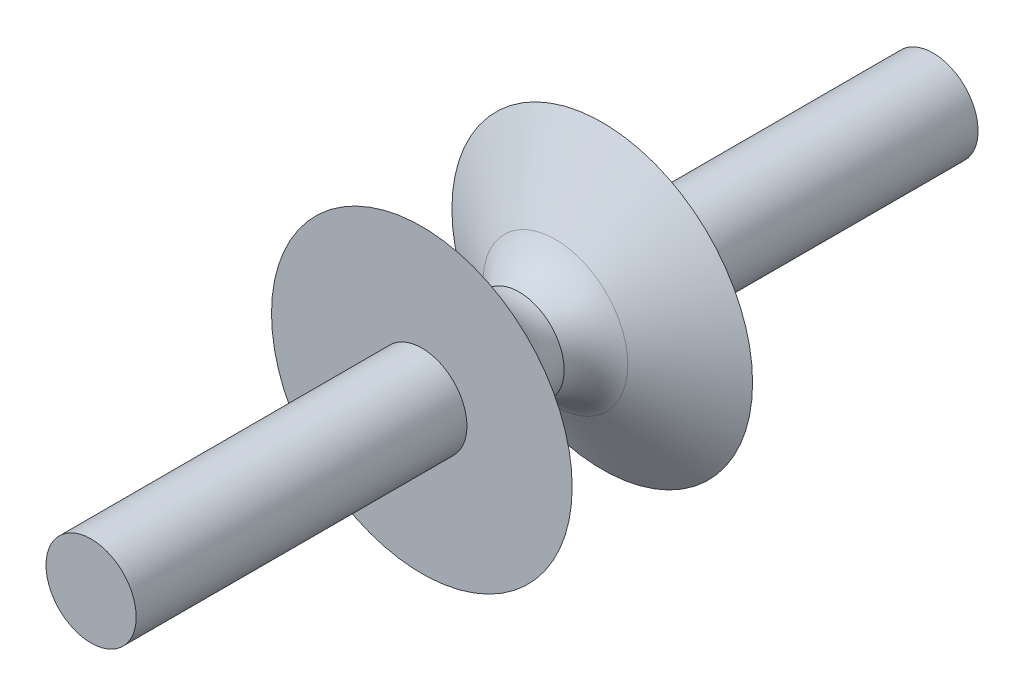
ISO-10303-21;
HEADER;
FILE_DESCRIPTION(('STEP AP214'),'2;1');
FILE_NAME('part.step','',(''),(''),'','','');
FILE_SCHEMA(('AUTOMOTIVE_DESIGN { 1 0 10303 214 1 1 1 1 }'));
ENDSEC;
DATA;
#1=APPLICATION_CONTEXT('core data for automotive mechanical design processes');
#2=APPLICATION_PROTOCOL_DEFINITION('international standard','automotive_design',2000,#1);
#3=PRODUCT_CONTEXT('',#1,'mechanical');
#4=PRODUCT('Part','Part','',(#3));
#5=PRODUCT_RELATED_PRODUCT_CATEGORY('part','',(#4));
#6=PRODUCT_DEFINITION_FORMATION('','',#4);
#7=PRODUCT_DEFINITION_CONTEXT('part definition',#1,'design');
#8=PRODUCT_DEFINITION('design','',#6,#7);
#9=PRODUCT_DEFINITION_SHAPE('','',#8);
#10=(LENGTH_UNIT() NAMED_UNIT(*) SI_UNIT(.MILLI.,.METRE.));
#11=(NAMED_UNIT(*) PLANE_ANGLE_UNIT() SI_UNIT($,.RADIAN.));
#12=(NAMED_UNIT(*) SI_UNIT($,.STERADIAN.) SOLID_ANGLE_UNIT());
#13=UNCERTAINTY_MEASURE_WITH_UNIT(LENGTH_MEASURE(1.E-05),#10,'distance_accuracy_value','');
#14=(GEOMETRIC_REPRESENTATION_CONTEXT(3) GLOBAL_UNCERTAINTY_ASSIGNED_CONTEXT((#13)) GLOBAL_UNIT_ASSIGNED_CONTEXT((#10,
#11,#12)) REPRESENTATION_CONTEXT('',''));
#15=CARTESIAN_POINT('',(0.,0.,0.));
#16=DIRECTION('',(0.,0.,1.));
#17=DIRECTION('',(1.,0.,0.));
#18=AXIS2_PLACEMENT_3D('',#15,#16,#17);
#19=CARTESIAN_POINT('',(0.,0.,10.));
#20=DIRECTION('',(0.,0.,-1.));
#21=DIRECTION('',(-1.,0.,0.));
#22=AXIS2_PLACEMENT_3D('',#19,#20,#21);
#23=CYLINDRICAL_SURFACE('',#22,0.750000000000001);
#24=CARTESIAN_POINT('',(0.,0.,3.5));
#25=DIRECTION('',(0.,0.,1.));
#26=DIRECTION('',(1.,0.,0.));
#27=AXIS2_PLACEMENT_3D('',#24,#25,#26);
#28=CIRCLE('',#27,0.750000000000001);
#29=CARTESIAN_POINT('',(0.750000000000001,0.,3.5));
#30=VERTEX_POINT('',#29);
#31=EDGE_CURVE('E61',#30,#30,#28,.T.);
#32=ORIENTED_EDGE('',*,*,#31,.F.);
#33=EDGE_LOOP('',(#32));
#34=FACE_BOUND('',#33,.T.);
#35=CARTESIAN_POINT('',(0.,0.,-2.));
#36=DIRECTION('',(0.,0.,-1.));
#37=DIRECTION('',(-1.,0.,0.));
#38=AXIS2_PLACEMENT_3D('',#35,#36,#37);
#39=CIRCLE('',#38,0.750000000000001);
#40=CARTESIAN_POINT('',(-0.750000000000001,0.,-2.));
#41=VERTEX_POINT('',#40);
#42=EDGE_CURVE('E73',#41,#41,#39,.T.);
#43=ORIENTED_EDGE('',*,*,#42,.F.);
#44=EDGE_LOOP('',(#43));
#45=FACE_BOUND('',#44,.T.);
#46=ADVANCED_FACE('F37',(#34,#45),#23,.T.);
#47=CARTESIAN_POINT('',(0.,0.,3.5));
#48=DIRECTION('',(0.,0.,-1.));
#49=DIRECTION('',(-1.,0.,0.));
#50=AXIS2_PLACEMENT_3D('',#47,#48,#49);
#51=CONICAL_SURFACE('',#50,2.5,1.03037682652431);
#52=CARTESIAN_POINT('',(0.,0.,4.27801382128375));
#53=DIRECTION('',(0.,0.,1.));
#54=DIRECTION('',(1.,0.,0.));
#55=AXIS2_PLACEMENT_3D('',#52,#53,#54);
#56=CIRCLE('',#55,1.20331029786041);
#57=CARTESIAN_POINT('',(1.20331029786041,0.,4.27801382128375));
#58=VERTEX_POINT('',#57);
#59=EDGE_CURVE('E10',#58,#58,#56,.F.);
#60=ORIENTED_EDGE('',*,*,#59,.T.);
#61=EDGE_LOOP('',(#60));
#62=FACE_BOUND('',#61,.T.);
#63=CARTESIAN_POINT('',(0.,0.,3.5));
#64=DIRECTION('',(0.,0.,1.));
#65=DIRECTION('',(1.,0.,0.));
#66=AXIS2_PLACEMENT_3D('',#63,#64,#65);
#67=CIRCLE('',#66,2.5);
#68=CARTESIAN_POINT('',(2.5,0.,3.5));
#69=VERTEX_POINT('',#68);
#70=EDGE_CURVE('E65',#69,#69,#67,.T.);
#71=ORIENTED_EDGE('',*,*,#70,.T.);
#72=EDGE_LOOP('',(#71));
#73=FACE_BOUND('',#72,.T.);
#74=ADVANCED_FACE('F102',(#62,#73),#51,.T.);
#75=CARTESIAN_POINT('',(0.,0.,3.5));
#76=DIRECTION('',(0.,0.,1.));
#77=DIRECTION('',(1.,0.,0.));
#78=AXIS2_PLACEMENT_3D('',#75,#76,#77);
#79=PLANE('',#78);
#80=ORIENTED_EDGE('',*,*,#31,.T.);
#81=EDGE_LOOP('',(#80));
#82=FACE_BOUND('',#81,.T.);
#83=ORIENTED_EDGE('',*,*,#70,.F.);
#84=EDGE_LOOP('',(#83));
#85=FACE_BOUND('',#84,.T.);
#86=ADVANCED_FACE('F108',(#82,#85),#79,.F.);
#87=CARTESIAN_POINT('',(0.,0.,6.5));
#88=DIRECTION('',(0.,0.,1.));
#89=DIRECTION('',(-1.,0.,0.));
#90=AXIS2_PLACEMENT_3D('',#87,#88,#89);
#91=CONICAL_SURFACE('',#90,2.5,1.03037682652431);
#92=CARTESIAN_POINT('',(0.,0.,5.74130254674349));
#93=DIRECTION('',(0.,0.,1.));
#94=DIRECTION('',(1.,0.,0.));
#95=AXIS2_PLACEMENT_3D('',#92,#93,#94);
#96=CIRCLE('',#95,1.23550424457247);
#97=CARTESIAN_POINT('',(1.23550424457247,0.,5.74130254674349));
#98=VERTEX_POINT('',#97);
#99=EDGE_CURVE('E50',#98,#98,#96,.T.);
#100=ORIENTED_EDGE('',*,*,#99,.T.);
#101=EDGE_LOOP('',(#100));
#102=FACE_BOUND('',#101,.T.);
#103=CARTESIAN_POINT('',(0.,0.,6.5));
#104=DIRECTION('',(0.,0.,1.));
#105=DIRECTION('',(1.,0.,0.));
#106=AXIS2_PLACEMENT_3D('',#103,#104,#105);
#107=CIRCLE('',#106,2.5);
#108=CARTESIAN_POINT('',(2.5,0.,6.5));
#109=VERTEX_POINT('',#108);
#110=EDGE_CURVE('E69',#109,#109,#107,.T.);
#111=ORIENTED_EDGE('',*,*,#110,.F.);
#112=EDGE_LOOP('',(#111));
#113=FACE_BOUND('',#112,.T.);
#114=ADVANCED_FACE('F97',(#102,#113),#91,.T.);
#115=CARTESIAN_POINT('',(0.,0.,6.5));
#116=DIRECTION('',(0.,0.,-1.));
#117=DIRECTION('',(1.,0.,0.));
#118=AXIS2_PLACEMENT_3D('',#115,#116,#117);
#119=PLANE('',#118);
#120=CARTESIAN_POINT('',(0.,0.,6.5));
#121=DIRECTION('',(0.,0.,-1.));
#122=DIRECTION('',(-1.,0.,0.));
#123=AXIS2_PLACEMENT_3D('',#120,#121,#122);
#124=CIRCLE('',#123,0.750000000000001);
#125=CARTESIAN_POINT('',(-0.750000000000001,0.,6.5));
#126=VERTEX_POINT('',#125);
#127=EDGE_CURVE('E55',#126,#126,#124,.T.);
#128=ORIENTED_EDGE('',*,*,#127,.T.);
#129=EDGE_LOOP('',(#128));
#130=FACE_BOUND('',#129,.T.);
#131=ORIENTED_EDGE('',*,*,#110,.T.);
#132=EDGE_LOOP('',(#131));
#133=FACE_BOUND('',#132,.T.);
#134=ADVANCED_FACE('F87',(#130,#133),#119,.F.);
#135=ORIENTED_EDGE('',*,*,#127,.F.);
#136=EDGE_LOOP('',(#135));
#137=FACE_BOUND('',#136,.T.);
#138=CARTESIAN_POINT('',(0.,0.,12.));
#139=DIRECTION('',(0.,0.,1.));
#140=DIRECTION('',(1.,0.,0.));
#141=AXIS2_PLACEMENT_3D('',#138,#139,#140);
#142=CIRCLE('',#141,0.750000000000001);
#143=CARTESIAN_POINT('',(0.750000000000001,0.,12.));
#144=VERTEX_POINT('',#143);
#145=EDGE_CURVE('E77',#144,#144,#142,.T.);
#146=ORIENTED_EDGE('',*,*,#145,.F.);
#147=EDGE_LOOP('',(#146));
#148=FACE_BOUND('',#147,.T.);
#149=ADVANCED_FACE('F84',(#137,#148),#23,.T.);
#150=CARTESIAN_POINT('',(0.,0.,4.88380962103094));
#151=DIRECTION('',(0.,0.,1.));
#152=DIRECTION('',(1.,0.,0.));
#153=AXIS2_PLACEMENT_3D('',#150,#151,#152);
#154=TOROIDAL_SURFACE('',#153,1.75,1.);
#155=CARTESIAN_POINT('',(0.,0.,4.88380962103094));
#156=DIRECTION('',(0.,0.,1.));
#157=DIRECTION('',(1.,0.,0.));
#158=AXIS2_PLACEMENT_3D('',#155,#156,#157);
#159=CIRCLE('',#158,0.750000000000001);
#160=CARTESIAN_POINT('',(0.750000000000001,0.,4.88380962103094));
#161=VERTEX_POINT('',#160);
#162=EDGE_CURVE('E45',#161,#161,#159,.F.);
#163=ORIENTED_EDGE('',*,*,#162,.F.);
#164=EDGE_LOOP('',(#163));
#165=FACE_BOUND('',#164,.T.);
#166=ORIENTED_EDGE('',*,*,#99,.F.);
#167=EDGE_LOOP('',(#166));
#168=FACE_BOUND('',#167,.T.);
#169=ADVANCED_FACE('F86',(#165,#168),#154,.F.);
#170=CARTESIAN_POINT('',(0.,0.,5.1355067469963));
#171=DIRECTION('',(0.,0.,1.));
#172=DIRECTION('',(1.,0.,0.));
#173=AXIS2_PLACEMENT_3D('',#170,#171,#172);
#174=TOROIDAL_SURFACE('',#173,1.71780605328794,1.);
#175=ORIENTED_EDGE('',*,*,#162,.T.);
#176=EDGE_LOOP('',(#175));
#177=FACE_BOUND('',#176,.T.);
#178=ORIENTED_EDGE('',*,*,#59,.F.);
#179=EDGE_LOOP('',(#178));
#180=FACE_BOUND('',#179,.T.);
#181=ADVANCED_FACE('F39',(#177,#180),#174,.F.);
#182=CARTESIAN_POINT('',(0.,0.,-2.));
#183=DIRECTION('',(0.,0.,-1.));
#184=DIRECTION('',(-1.,0.,0.));
#185=AXIS2_PLACEMENT_3D('',#182,#183,#184);
#186=PLANE('',#185);
#187=ORIENTED_EDGE('',*,*,#42,.T.);
#188=EDGE_LOOP('',(#187));
#189=FACE_BOUND('',#188,.T.);
#190=ADVANCED_FACE('F114',(#189),#186,.T.);
#191=CARTESIAN_POINT('',(0.,0.,12.));
#192=DIRECTION('',(0.,0.,1.));
#193=DIRECTION('',(1.,0.,0.));
#194=AXIS2_PLACEMENT_3D('',#191,#192,#193);
#195=PLANE('',#194);
#196=ORIENTED_EDGE('',*,*,#145,.T.);
#197=EDGE_LOOP('',(#196));
#198=FACE_BOUND('',#197,.T.);
#199=ADVANCED_FACE('F82',(#198),#195,.T.);
#200=CLOSED_SHELL('',(#46,#74,#86,#114,#134,#149,#169,#181,#190,#199));
#201=MANIFOLD_SOLID_BREP('B2',#200);
#202=ADVANCED_BREP_SHAPE_REPRESENTATION('',(#18,#201),#14);
#203=SHAPE_DEFINITION_REPRESENTATION(#9,#202);
ENDSEC;
END-ISO-10303-21;
